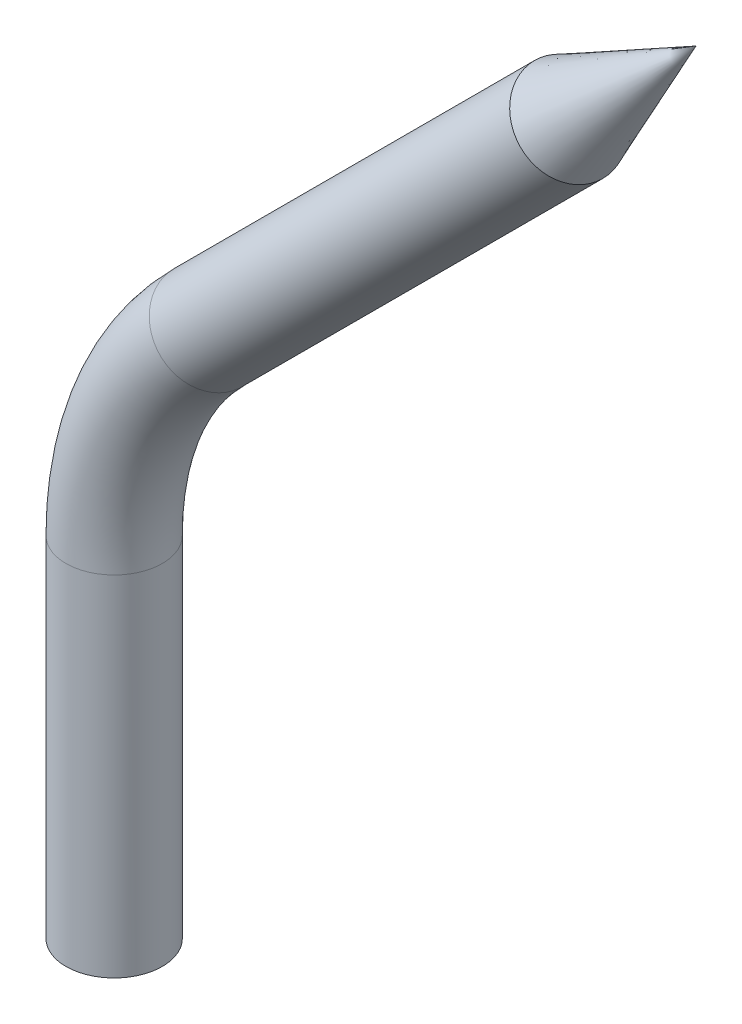
ISO-10303-21;
HEADER;
FILE_DESCRIPTION(('STEP AP214'),'2;1');
FILE_NAME('part.step','',(''),(''),'','','');
FILE_SCHEMA(('AUTOMOTIVE_DESIGN { 1 0 10303 214 1 1 1 1 }'));
ENDSEC;
DATA;
#1=APPLICATION_CONTEXT('core data for automotive mechanical design processes');
#2=APPLICATION_PROTOCOL_DEFINITION('international standard','automotive_design',2000,#1);
#3=PRODUCT_CONTEXT('',#1,'mechanical');
#4=PRODUCT('Part','Part','',(#3));
#5=PRODUCT_RELATED_PRODUCT_CATEGORY('part','',(#4));
#6=PRODUCT_DEFINITION_FORMATION('','',#4);
#7=PRODUCT_DEFINITION_CONTEXT('part definition',#1,'design');
#8=PRODUCT_DEFINITION('design','',#6,#7);
#9=PRODUCT_DEFINITION_SHAPE('','',#8);
#10=(LENGTH_UNIT() NAMED_UNIT(*) SI_UNIT(.MILLI.,.METRE.));
#11=(NAMED_UNIT(*) PLANE_ANGLE_UNIT() SI_UNIT($,.RADIAN.));
#12=(NAMED_UNIT(*) SI_UNIT($,.STERADIAN.) SOLID_ANGLE_UNIT());
#13=UNCERTAINTY_MEASURE_WITH_UNIT(LENGTH_MEASURE(1.E-05),#10,'distance_accuracy_value','');
#14=(GEOMETRIC_REPRESENTATION_CONTEXT(3) GLOBAL_UNCERTAINTY_ASSIGNED_CONTEXT((#13)) GLOBAL_UNIT_ASSIGNED_CONTEXT((#10,
#11,#12)) REPRESENTATION_CONTEXT('',''));
#15=CARTESIAN_POINT('',(0.,0.,0.));
#16=DIRECTION('',(0.,0.,1.));
#17=DIRECTION('',(1.,0.,0.));
#18=AXIS2_PLACEMENT_3D('',#15,#16,#17);
#19=CARTESIAN_POINT('',(0.585786437626908,25.5857864376269,0.));
#20=DIRECTION('',(0.70710678118655,0.707106781186545,0.));
#21=DIRECTION('',(-0.707106781186545,0.70710678118655,0.));
#22=AXIS2_PLACEMENT_3D('',#19,#20,#21);
#23=CYLINDRICAL_SURFACE('',#22,0.3);
#24=CARTESIAN_POINT('',(0.585786437626908,25.5857864376269,0.));
#25=DIRECTION('',(0.707106781186549,0.707106781186547,0.));
#26=DIRECTION('',(0.,0.,1.));
#27=AXIS2_PLACEMENT_3D('',#24,#25,#26);
#28=CIRCLE('',#27,0.3);
#29=CARTESIAN_POINT('',(0.373654403270944,25.7979184719829,0.));
#30=VERTEX_POINT('',#29);
#31=EDGE_CURVE('E68',#30,#30,#28,.T.);
#32=ORIENTED_EDGE('',*,*,#31,.T.);
#33=EDGE_LOOP('',(#32));
#34=FACE_BOUND('',#33,.T.);
#35=CARTESIAN_POINT('',(2.8284271247462,27.8284271247462,0.));
#36=DIRECTION('',(0.707106781186549,0.707106781186547,0.));
#37=DIRECTION('',(0.,0.,1.));
#38=AXIS2_PLACEMENT_3D('',#35,#36,#37);
#39=CIRCLE('',#38,0.3);
#40=CARTESIAN_POINT('',(2.8284271247462,27.8284271247462,0.3));
#41=VERTEX_POINT('',#40);
#42=EDGE_CURVE('E40',#41,#41,#39,.T.);
#43=ORIENTED_EDGE('',*,*,#42,.F.);
#44=EDGE_LOOP('',(#43));
#45=FACE_BOUND('',#44,.T.);
#46=ADVANCED_FACE('F34',(#34,#45),#23,.T.);
#47=CARTESIAN_POINT('',(2.,24.1715728752538,0.));
#48=DIRECTION('',(0.,0.,-1.));
#49=DIRECTION('',(-1.,0.,0.));
#50=AXIS2_PLACEMENT_3D('',#47,#48,#49);
#51=TOROIDAL_SURFACE('',#50,2.,0.3);
#52=CARTESIAN_POINT('',(0.,24.1715728752538,0.));
#53=DIRECTION('',(0.,1.,0.));
#54=DIRECTION('',(0.,0.,1.));
#55=AXIS2_PLACEMENT_3D('',#52,#53,#54);
#56=CIRCLE('',#55,0.3);
#57=CARTESIAN_POINT('',(-0.3,24.1715728752538,0.));
#58=VERTEX_POINT('',#57);
#59=EDGE_CURVE('E70',#58,#58,#56,.T.);
#60=CARTESIAN_POINT('',(2.,24.1715728752538,0.));
#61=DIRECTION('',(0.,0.,-1.));
#62=DIRECTION('',(-1.,0.,0.));
#63=AXIS2_PLACEMENT_3D('',#60,#61,#62);
#64=CIRCLE('',#63,2.3);
#65=EDGE_CURVE('',#58,#30,#64,.T.);
#66=ORIENTED_EDGE('',*,*,#59,.T.);
#67=ORIENTED_EDGE('',*,*,#31,.F.);
#68=ORIENTED_EDGE('',*,*,#65,.T.);
#69=ORIENTED_EDGE('',*,*,#65,.F.);
#70=EDGE_LOOP('',(#66,#68,#67,#69));
#71=FACE_BOUND('',#70,.T.);
#72=ADVANCED_FACE('F55',(#71),#51,.T.);
#73=CARTESIAN_POINT('',(0.,24.1715728752538,0.));
#74=DIRECTION('',(0.,-1.,0.));
#75=DIRECTION('',(0.,0.,-1.));
#76=AXIS2_PLACEMENT_3D('',#73,#74,#75);
#77=CYLINDRICAL_SURFACE('',#76,0.3);
#78=ORIENTED_EDGE('',*,*,#59,.F.);
#79=EDGE_LOOP('',(#78));
#80=FACE_BOUND('',#79,.T.);
#81=CARTESIAN_POINT('',(0.,22.,0.));
#82=DIRECTION('',(0.,1.,0.));
#83=DIRECTION('',(0.,0.,1.));
#84=AXIS2_PLACEMENT_3D('',#81,#82,#83);
#85=CIRCLE('',#84,0.3);
#86=CARTESIAN_POINT('',(0.,22.,0.3));
#87=VERTEX_POINT('',#86);
#88=EDGE_CURVE('E11',#87,#87,#85,.T.);
#89=ORIENTED_EDGE('',*,*,#88,.T.);
#90=EDGE_LOOP('',(#89));
#91=FACE_BOUND('',#90,.T.);
#92=ADVANCED_FACE('F46',(#80,#91),#77,.T.);
#93=CARTESIAN_POINT('',(3.62011465487564,28.6201146548756,0.));
#94=DIRECTION('',(-0.707106781186551,-0.707106781186544,0.));
#95=DIRECTION('',(0.707106781186544,-0.707106781186551,0.));
#96=AXIS2_PLACEMENT_3D('',#93,#94,#95);
#97=CONICAL_SURFACE('',#96,0.,0.261799387799142);
#98=ORIENTED_EDGE('',*,*,#42,.T.);
#99=EDGE_LOOP('',(#98));
#100=FACE_BOUND('',#99,.T.);
#101=CARTESIAN_POINT('',(3.62011465487564,28.6201146548756,0.));
#102=VERTEX_POINT('',#101);
#103=VERTEX_LOOP('',#102);
#104=FACE_BOUND('',#103,.T.);
#105=ADVANCED_FACE('F43',(#100,#104),#97,.T.);
#106=CARTESIAN_POINT('',(-2.5,22.,-0.300000000000002));
#107=DIRECTION('',(0.,1.,0.));
#108=DIRECTION('',(0.,0.,1.));
#109=AXIS2_PLACEMENT_3D('',#106,#107,#108);
#110=PLANE('',#109);
#111=ORIENTED_EDGE('',*,*,#88,.F.);
#112=EDGE_LOOP('',(#111));
#113=FACE_BOUND('',#112,.T.);
#114=ADVANCED_FACE('F45',(#113),#110,.F.);
#115=CLOSED_SHELL('',(#46,#72,#92,#105,#114));
#116=MANIFOLD_SOLID_BREP('B2',#115);
#117=ADVANCED_BREP_SHAPE_REPRESENTATION('',(#18,#116),#14);
#118=SHAPE_DEFINITION_REPRESENTATION(#9,#117);
ENDSEC;
END-ISO-10303-21;
